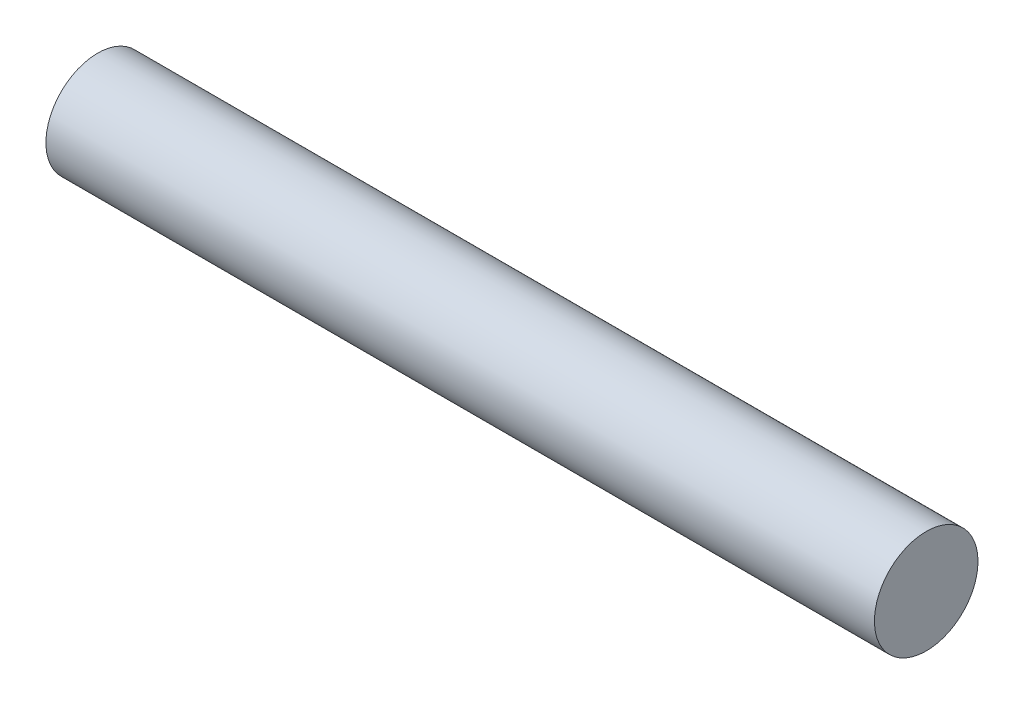
ISO-10303-21;
HEADER;
FILE_DESCRIPTION(('STEP AP214'),'2;1');
FILE_NAME('part.step','',(''),(''),'','','');
FILE_SCHEMA(('AUTOMOTIVE_DESIGN { 1 0 10303 214 1 1 1 1 }'));
ENDSEC;
DATA;
#1=APPLICATION_CONTEXT('core data for automotive mechanical design processes');
#2=APPLICATION_PROTOCOL_DEFINITION('international standard','automotive_design',2000,#1);
#3=PRODUCT_CONTEXT('',#1,'mechanical');
#4=PRODUCT('Part','Part','',(#3));
#5=PRODUCT_RELATED_PRODUCT_CATEGORY('part','',(#4));
#6=PRODUCT_DEFINITION_FORMATION('','',#4);
#7=PRODUCT_DEFINITION_CONTEXT('part definition',#1,'design');
#8=PRODUCT_DEFINITION('design','',#6,#7);
#9=PRODUCT_DEFINITION_SHAPE('','',#8);
#10=(LENGTH_UNIT() NAMED_UNIT(*) SI_UNIT(.MILLI.,.METRE.));
#11=(NAMED_UNIT(*) PLANE_ANGLE_UNIT() SI_UNIT($,.RADIAN.));
#12=(NAMED_UNIT(*) SI_UNIT($,.STERADIAN.) SOLID_ANGLE_UNIT());
#13=UNCERTAINTY_MEASURE_WITH_UNIT(LENGTH_MEASURE(1.E-05),#10,'distance_accuracy_value','');
#14=(GEOMETRIC_REPRESENTATION_CONTEXT(3) GLOBAL_UNCERTAINTY_ASSIGNED_CONTEXT((#13)) GLOBAL_UNIT_ASSIGNED_CONTEXT((#10,
#11,#12)) REPRESENTATION_CONTEXT('',''));
#15=CARTESIAN_POINT('',(0.,0.,0.));
#16=DIRECTION('',(0.,0.,1.));
#17=DIRECTION('',(1.,0.,0.));
#18=AXIS2_PLACEMENT_3D('',#15,#16,#17);
#19=CARTESIAN_POINT('',(6.,0.,0.));
#20=DIRECTION('',(-1.,0.,0.));
#21=DIRECTION('',(0.,0.,1.));
#22=AXIS2_PLACEMENT_3D('',#19,#20,#21);
#23=CYLINDRICAL_SURFACE('',#22,0.375);
#24=CARTESIAN_POINT('',(6.,0.,0.));
#25=DIRECTION('',(1.,0.,0.));
#26=DIRECTION('',(0.,0.,-1.));
#27=AXIS2_PLACEMENT_3D('',#24,#25,#26);
#28=CIRCLE('',#27,0.375);
#29=CARTESIAN_POINT('',(6.,0.,-0.375));
#30=VERTEX_POINT('',#29);
#31=EDGE_CURVE('E10',#30,#30,#28,.T.);
#32=ORIENTED_EDGE('',*,*,#31,.F.);
#33=EDGE_LOOP('',(#32));
#34=FACE_BOUND('',#33,.T.);
#35=CARTESIAN_POINT('',(0.,0.,0.));
#36=DIRECTION('',(1.,0.,0.));
#37=DIRECTION('',(0.,0.,-1.));
#38=AXIS2_PLACEMENT_3D('',#35,#36,#37);
#39=CIRCLE('',#38,0.375);
#40=CARTESIAN_POINT('',(0.,0.,-0.375));
#41=VERTEX_POINT('',#40);
#42=EDGE_CURVE('E40',#41,#41,#39,.T.);
#43=ORIENTED_EDGE('',*,*,#42,.T.);
#44=EDGE_LOOP('',(#43));
#45=FACE_BOUND('',#44,.T.);
#46=ADVANCED_FACE('F37',(#34,#45),#23,.T.);
#47=CARTESIAN_POINT('',(6.,0.,0.));
#48=DIRECTION('',(1.,0.,0.));
#49=DIRECTION('',(0.,0.,-1.));
#50=AXIS2_PLACEMENT_3D('',#47,#48,#49);
#51=PLANE('',#50);
#52=ORIENTED_EDGE('',*,*,#31,.T.);
#53=EDGE_LOOP('',(#52));
#54=FACE_BOUND('',#53,.T.);
#55=ADVANCED_FACE('F54',(#54),#51,.T.);
#56=CARTESIAN_POINT('',(0.,0.,0.));
#57=DIRECTION('',(1.,0.,0.));
#58=DIRECTION('',(0.,0.,-1.));
#59=AXIS2_PLACEMENT_3D('',#56,#57,#58);
#60=PLANE('',#59);
#61=ORIENTED_EDGE('',*,*,#42,.F.);
#62=EDGE_LOOP('',(#61));
#63=FACE_BOUND('',#62,.T.);
#64=ADVANCED_FACE('F52',(#63),#60,.F.);
#65=CLOSED_SHELL('',(#46,#55,#64));
#66=MANIFOLD_SOLID_BREP('B2',#65);
#67=ADVANCED_BREP_SHAPE_REPRESENTATION('',(#18,#66),#14);
#68=SHAPE_DEFINITION_REPRESENTATION(#9,#67);
ENDSEC;
END-ISO-10303-21;
